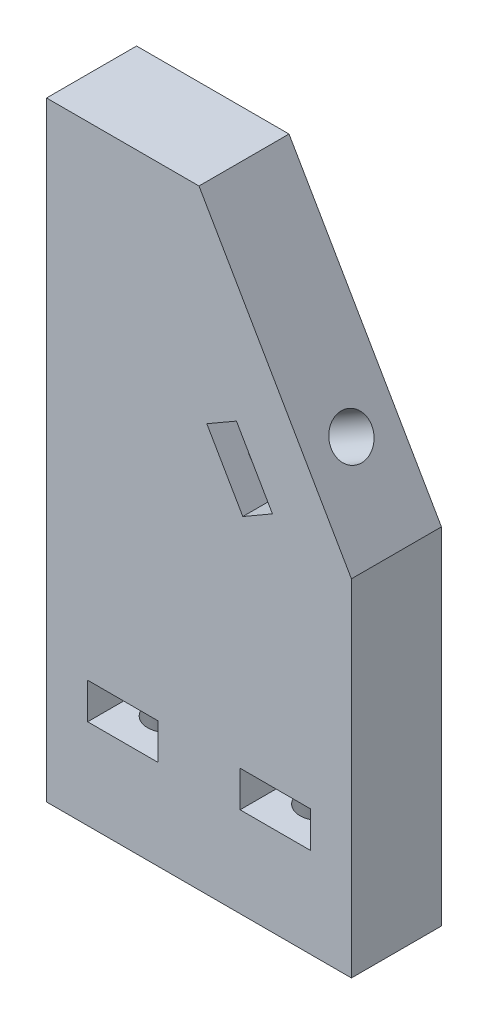
ISO-10303-21;
HEADER;
FILE_DESCRIPTION(('STEP AP214'),'2;1');
FILE_NAME('part.step','',(''),(''),'','','');
FILE_SCHEMA(('AUTOMOTIVE_DESIGN { 1 0 10303 214 1 1 1 1 }'));
ENDSEC;
DATA;
#1=APPLICATION_CONTEXT('core data for automotive mechanical design processes');
#2=APPLICATION_PROTOCOL_DEFINITION('international standard','automotive_design',2000,#1);
#3=PRODUCT_CONTEXT('',#1,'mechanical');
#4=PRODUCT('Part','Part','',(#3));
#5=PRODUCT_RELATED_PRODUCT_CATEGORY('part','',(#4));
#6=PRODUCT_DEFINITION_FORMATION('','',#4);
#7=PRODUCT_DEFINITION_CONTEXT('part definition',#1,'design');
#8=PRODUCT_DEFINITION('design','',#6,#7);
#9=PRODUCT_DEFINITION_SHAPE('','',#8);
#10=(LENGTH_UNIT() NAMED_UNIT(*) SI_UNIT(.MILLI.,.METRE.));
#11=(NAMED_UNIT(*) PLANE_ANGLE_UNIT() SI_UNIT($,.RADIAN.));
#12=(NAMED_UNIT(*) SI_UNIT($,.STERADIAN.) SOLID_ANGLE_UNIT());
#13=UNCERTAINTY_MEASURE_WITH_UNIT(LENGTH_MEASURE(1.E-05),#10,'distance_accuracy_value','');
#14=(GEOMETRIC_REPRESENTATION_CONTEXT(3) GLOBAL_UNCERTAINTY_ASSIGNED_CONTEXT((#13)) GLOBAL_UNIT_ASSIGNED_CONTEXT((#10,
#11,#12)) REPRESENTATION_CONTEXT('',''));
#15=CARTESIAN_POINT('',(0.,0.,0.));
#16=DIRECTION('',(0.,0.,1.));
#17=DIRECTION('',(1.,0.,0.));
#18=AXIS2_PLACEMENT_3D('',#15,#16,#17);
#19=CARTESIAN_POINT('',(0.,0.,7.5));
#20=DIRECTION('',(0.,0.,1.));
#21=DIRECTION('',(1.,0.,0.));
#22=AXIS2_PLACEMENT_3D('',#19,#20,#21);
#23=PLANE('',#22);
#24=DIRECTION('',(-1.,0.,0.));
#25=VECTOR('',#24,1.);
#26=CARTESIAN_POINT('',(-43.95,-7.80295474387528,7.5));
#27=LINE('',#26,#25);
#28=CARTESIAN_POINT('',(-32.25,-7.80295474387528,7.5));
#29=VERTEX_POINT('',#28);
#30=CARTESIAN_POINT('',(-43.95,-7.80295474387528,7.5));
#31=VERTEX_POINT('',#30);
#32=EDGE_CURVE('E172',#29,#31,#27,.T.);
#33=ORIENTED_EDGE('',*,*,#32,.F.);
#34=DIRECTION('',(0.,-1.,0.));
#35=VECTOR('',#34,1.);
#36=CARTESIAN_POINT('',(-32.25,-7.80295474387528,7.5));
#37=LINE('',#36,#35);
#38=CARTESIAN_POINT('',(-32.25,-13.8029547438753,7.5));
#39=VERTEX_POINT('',#38);
#40=EDGE_CURVE('E211',#29,#39,#37,.T.);
#41=ORIENTED_EDGE('',*,*,#40,.T.);
#42=DIRECTION('',(-1.,0.,0.));
#43=VECTOR('',#42,1.);
#44=CARTESIAN_POINT('',(-43.95,-13.8029547438753,7.5));
#45=LINE('',#44,#43);
#46=CARTESIAN_POINT('',(-43.95,-13.8029547438753,7.5));
#47=VERTEX_POINT('',#46);
#48=EDGE_CURVE('E174',#39,#47,#45,.T.);
#49=ORIENTED_EDGE('',*,*,#48,.T.);
#50=DIRECTION('',(0.,-1.,0.));
#51=VECTOR('',#50,1.);
#52=CARTESIAN_POINT('',(-43.95,-7.80295474387528,7.5));
#53=LINE('',#52,#51);
#54=EDGE_CURVE('E59',#31,#47,#53,.T.);
#55=ORIENTED_EDGE('',*,*,#54,.F.);
#56=EDGE_LOOP('',(#33,#41,#49,#55));
#57=FACE_BOUND('',#56,.T.);
#58=DIRECTION('',(-1.,0.,0.));
#59=VECTOR('',#58,1.);
#60=CARTESIAN_POINT('',(-25.4000000000001,72.7970452561247,7.5));
#61=LINE('',#60,#59);
#62=CARTESIAN_POINT('',(-25.4000000000001,72.7970452561247,7.5));
#63=VERTEX_POINT('',#62);
#64=CARTESIAN_POINT('',(-50.8,72.7970452561247,7.5));
#65=VERTEX_POINT('',#64);
#66=EDGE_CURVE('E310',#63,#65,#61,.T.);
#67=ORIENTED_EDGE('',*,*,#66,.T.);
#68=DIRECTION('',(0.,-1.,0.));
#69=VECTOR('',#68,1.);
#70=CARTESIAN_POINT('',(-50.8,72.7970452561247,7.5));
#71=LINE('',#70,#69);
#72=CARTESIAN_POINT('',(-50.8,-28.8029547438753,7.5));
#73=VERTEX_POINT('',#72);
#74=EDGE_CURVE('E314',#65,#73,#71,.T.);
#75=ORIENTED_EDGE('',*,*,#74,.T.);
#76=DIRECTION('',(1.,0.,0.));
#77=VECTOR('',#76,1.);
#78=CARTESIAN_POINT('',(-50.8,-28.8029547438753,7.5));
#79=LINE('',#78,#77);
#80=CARTESIAN_POINT('',(0.,-28.8029547438753,7.5));
#81=VERTEX_POINT('',#80);
#82=EDGE_CURVE('E318',#73,#81,#79,.T.);
#83=ORIENTED_EDGE('',*,*,#82,.T.);
#84=DIRECTION('',(0.,1.,0.));
#85=VECTOR('',#84,1.);
#86=CARTESIAN_POINT('',(0.,-28.8029547438753,7.5));
#87=LINE('',#86,#85);
#88=CARTESIAN_POINT('',(0.,28.8029547438753,7.5));
#89=VERTEX_POINT('',#88);
#90=EDGE_CURVE('E321',#81,#89,#87,.T.);
#91=ORIENTED_EDGE('',*,*,#90,.T.);
#92=DIRECTION('',(-0.500000000000002,0.866025403784438,0.));
#93=VECTOR('',#92,1.);
#94=CARTESIAN_POINT('',(0.,28.8029547438753,7.5));
#95=LINE('',#94,#93);
#96=EDGE_CURVE('E324',#89,#63,#95,.T.);
#97=ORIENTED_EDGE('',*,*,#96,.T.);
#98=EDGE_LOOP('',(#67,#75,#83,#91,#97));
#99=FACE_BOUND('',#98,.T.);
#100=DIRECTION('',(0.866025403784438,0.500000000000001,0.));
#101=VECTOR('',#100,1.);
#102=CARTESIAN_POINT('',(-18.0965988394157,28.7471833779352,7.5));
#103=LINE('',#102,#101);
#104=CARTESIAN_POINT('',(-18.0965988394157,28.7471833779352,7.5));
#105=VERTEX_POINT('',#104);
#106=CARTESIAN_POINT('',(-13.1602540378444,31.5971833779352,7.5));
#107=VERTEX_POINT('',#106);
#108=EDGE_CURVE('E304',#105,#107,#103,.T.);
#109=ORIENTED_EDGE('',*,*,#108,.F.);
#110=DIRECTION('',(0.500000000000001,-0.866025403784438,0.));
#111=VECTOR('',#110,1.);
#112=CARTESIAN_POINT('',(-24.0965988394157,39.1394882233485,7.5));
#113=LINE('',#112,#111);
#114=CARTESIAN_POINT('',(-24.0965988394157,39.1394882233485,7.5));
#115=VERTEX_POINT('',#114);
#116=EDGE_CURVE('E270',#115,#105,#113,.T.);
#117=ORIENTED_EDGE('',*,*,#116,.F.);
#118=DIRECTION('',(0.866025403784438,0.500000000000001,0.));
#119=VECTOR('',#118,1.);
#120=CARTESIAN_POINT('',(-24.0965988394157,39.1394882233485,7.5));
#121=LINE('',#120,#119);
#122=CARTESIAN_POINT('',(-19.1602540378444,41.9894882233485,7.5));
#123=VERTEX_POINT('',#122);
#124=EDGE_CURVE('E282',#115,#123,#121,.T.);
#125=ORIENTED_EDGE('',*,*,#124,.T.);
#126=DIRECTION('',(0.500000000000001,-0.866025403784438,0.));
#127=VECTOR('',#126,1.);
#128=CARTESIAN_POINT('',(-19.1602540378444,41.9894882233485,7.5));
#129=LINE('',#128,#127);
#130=EDGE_CURVE('E286',#123,#107,#129,.T.);
#131=ORIENTED_EDGE('',*,*,#130,.T.);
#132=EDGE_LOOP('',(#109,#117,#125,#131));
#133=FACE_BOUND('',#132,.T.);
#134=DIRECTION('',(0.,-1.,0.));
#135=VECTOR('',#134,1.);
#136=CARTESIAN_POINT('',(-18.55,-7.80295474387528,7.5));
#137=LINE('',#136,#135);
#138=CARTESIAN_POINT('',(-18.55,-7.80295474387528,7.5));
#139=VERTEX_POINT('',#138);
#140=CARTESIAN_POINT('',(-18.55,-13.8029547438753,7.5));
#141=VERTEX_POINT('',#140);
#142=EDGE_CURVE('E67',#139,#141,#137,.T.);
#143=ORIENTED_EDGE('',*,*,#142,.F.);
#144=DIRECTION('',(-1.,0.,0.));
#145=VECTOR('',#144,1.);
#146=CARTESIAN_POINT('',(-6.85,-7.80295474387528,7.5));
#147=LINE('',#146,#145);
#148=CARTESIAN_POINT('',(-6.85,-7.80295474387528,7.5));
#149=VERTEX_POINT('',#148);
#150=EDGE_CURVE('E225',#149,#139,#147,.T.);
#151=ORIENTED_EDGE('',*,*,#150,.F.);
#152=DIRECTION('',(0.,-1.,0.));
#153=VECTOR('',#152,1.);
#154=CARTESIAN_POINT('',(-6.85,-7.80295474387528,7.5));
#155=LINE('',#154,#153);
#156=CARTESIAN_POINT('',(-6.85,-13.8029547438753,7.5));
#157=VERTEX_POINT('',#156);
#158=EDGE_CURVE('E253',#149,#157,#155,.T.);
#159=ORIENTED_EDGE('',*,*,#158,.T.);
#160=DIRECTION('',(-1.,0.,0.));
#161=VECTOR('',#160,1.);
#162=CARTESIAN_POINT('',(-6.85,-13.8029547438753,7.5));
#163=LINE('',#162,#161);
#164=EDGE_CURVE('E242',#157,#141,#163,.T.);
#165=ORIENTED_EDGE('',*,*,#164,.T.);
#166=EDGE_LOOP('',(#143,#151,#159,#165));
#167=FACE_BOUND('',#166,.T.);
#168=ADVANCED_FACE('F43',(#57,#99,#133,#167),#23,.T.);
#169=CARTESIAN_POINT('',(0.,0.,-7.5));
#170=DIRECTION('',(0.,0.,1.));
#171=DIRECTION('',(1.,0.,0.));
#172=AXIS2_PLACEMENT_3D('',#169,#170,#171);
#173=PLANE('',#172);
#174=DIRECTION('',(0.,-1.,0.));
#175=VECTOR('',#174,1.);
#176=CARTESIAN_POINT('',(-32.25,-7.80295474387528,-7.5));
#177=LINE('',#176,#175);
#178=CARTESIAN_POINT('',(-32.25,-7.80295474387528,-7.5));
#179=VERTEX_POINT('',#178);
#180=CARTESIAN_POINT('',(-32.25,-13.8029547438753,-7.5));
#181=VERTEX_POINT('',#180);
#182=EDGE_CURVE('E183',#179,#181,#177,.T.);
#183=ORIENTED_EDGE('',*,*,#182,.F.);
#184=DIRECTION('',(1.,0.,0.));
#185=VECTOR('',#184,1.);
#186=CARTESIAN_POINT('',(-32.25,-7.80295474387528,-7.5));
#187=LINE('',#186,#185);
#188=CARTESIAN_POINT('',(-43.95,-7.80295474387528,-7.5));
#189=VERTEX_POINT('',#188);
#190=EDGE_CURVE('E169',#189,#179,#187,.T.);
#191=ORIENTED_EDGE('',*,*,#190,.F.);
#192=DIRECTION('',(0.,-1.,0.));
#193=VECTOR('',#192,1.);
#194=CARTESIAN_POINT('',(-43.95,-7.80295474387528,-7.5));
#195=LINE('',#194,#193);
#196=CARTESIAN_POINT('',(-43.95,-13.8029547438753,-7.5));
#197=VERTEX_POINT('',#196);
#198=EDGE_CURVE('E177',#189,#197,#195,.T.);
#199=ORIENTED_EDGE('',*,*,#198,.T.);
#200=DIRECTION('',(1.,0.,0.));
#201=VECTOR('',#200,1.);
#202=CARTESIAN_POINT('',(-32.25,-13.8029547438753,-7.5));
#203=LINE('',#202,#201);
#204=EDGE_CURVE('E198',#197,#181,#203,.T.);
#205=ORIENTED_EDGE('',*,*,#204,.T.);
#206=EDGE_LOOP('',(#183,#191,#199,#205));
#207=FACE_BOUND('',#206,.T.);
#208=DIRECTION('',(-0.500000000000001,0.866025403784438,0.));
#209=VECTOR('',#208,1.);
#210=CARTESIAN_POINT('',(-18.0965988394157,28.7471833779352,-7.5));
#211=LINE('',#210,#209);
#212=CARTESIAN_POINT('',(-18.0965988394157,28.7471833779352,-7.5));
#213=VERTEX_POINT('',#212);
#214=CARTESIAN_POINT('',(-24.0965988394157,39.1394882233485,-7.5));
#215=VERTEX_POINT('',#214);
#216=EDGE_CURVE('E278',#213,#215,#211,.T.);
#217=ORIENTED_EDGE('',*,*,#216,.F.);
#218=DIRECTION('',(0.866025403784438,0.500000000000001,0.));
#219=VECTOR('',#218,1.);
#220=CARTESIAN_POINT('',(-18.0965988394157,28.7471833779352,-7.5));
#221=LINE('',#220,#219);
#222=CARTESIAN_POINT('',(-13.1602540378444,31.5971833779352,-7.5));
#223=VERTEX_POINT('',#222);
#224=EDGE_CURVE('E300',#213,#223,#221,.T.);
#225=ORIENTED_EDGE('',*,*,#224,.T.);
#226=DIRECTION('',(-0.500000000000001,0.866025403784438,0.));
#227=VECTOR('',#226,1.);
#228=CARTESIAN_POINT('',(-13.1602540378444,31.5971833779352,-7.5));
#229=LINE('',#228,#227);
#230=CARTESIAN_POINT('',(-19.1602540378444,41.9894882233485,-7.5));
#231=VERTEX_POINT('',#230);
#232=EDGE_CURVE('E271',#223,#231,#229,.T.);
#233=ORIENTED_EDGE('',*,*,#232,.T.);
#234=DIRECTION('',(0.866025403784438,0.500000000000001,0.));
#235=VECTOR('',#234,1.);
#236=CARTESIAN_POINT('',(-24.0965988394157,39.1394882233485,-7.5));
#237=LINE('',#236,#235);
#238=EDGE_CURVE('E296',#215,#231,#237,.T.);
#239=ORIENTED_EDGE('',*,*,#238,.F.);
#240=EDGE_LOOP('',(#217,#225,#233,#239));
#241=FACE_BOUND('',#240,.T.);
#242=DIRECTION('',(-1.,0.,0.));
#243=VECTOR('',#242,1.);
#244=CARTESIAN_POINT('',(-25.4000000000001,72.7970452561247,-7.5));
#245=LINE('',#244,#243);
#246=CARTESIAN_POINT('',(-25.4000000000001,72.7970452561247,-7.5));
#247=VERTEX_POINT('',#246);
#248=CARTESIAN_POINT('',(-50.8,72.7970452561247,-7.5));
#249=VERTEX_POINT('',#248);
#250=EDGE_CURVE('E299',#247,#249,#245,.T.);
#251=ORIENTED_EDGE('',*,*,#250,.F.);
#252=DIRECTION('',(-0.500000000000002,0.866025403784438,0.));
#253=VECTOR('',#252,1.);
#254=CARTESIAN_POINT('',(0.,28.8029547438753,-7.5));
#255=LINE('',#254,#253);
#256=CARTESIAN_POINT('',(0.,28.8029547438753,-7.5));
#257=VERTEX_POINT('',#256);
#258=EDGE_CURVE('E315',#257,#247,#255,.T.);
#259=ORIENTED_EDGE('',*,*,#258,.F.);
#260=DIRECTION('',(0.,1.,0.));
#261=VECTOR('',#260,1.);
#262=CARTESIAN_POINT('',(0.,-28.8029547438753,-7.5));
#263=LINE('',#262,#261);
#264=CARTESIAN_POINT('',(0.,-28.8029547438753,-7.5));
#265=VERTEX_POINT('',#264);
#266=EDGE_CURVE('E338',#265,#257,#263,.T.);
#267=ORIENTED_EDGE('',*,*,#266,.F.);
#268=DIRECTION('',(1.,0.,0.));
#269=VECTOR('',#268,1.);
#270=CARTESIAN_POINT('',(-25.4000000000001,-28.8029547438753,-7.5));
#271=LINE('',#270,#269);
#272=CARTESIAN_POINT('',(-50.8,-28.8029547438753,-7.5));
#273=VERTEX_POINT('',#272);
#274=EDGE_CURVE('E335',#273,#265,#271,.T.);
#275=ORIENTED_EDGE('',*,*,#274,.F.);
#276=DIRECTION('',(0.,-1.,0.));
#277=VECTOR('',#276,1.);
#278=CARTESIAN_POINT('',(-50.8,72.7970452561247,-7.5));
#279=LINE('',#278,#277);
#280=EDGE_CURVE('E331',#249,#273,#279,.T.);
#281=ORIENTED_EDGE('',*,*,#280,.F.);
#282=EDGE_LOOP('',(#251,#259,#267,#275,#281));
#283=FACE_BOUND('',#282,.T.);
#284=DIRECTION('',(1.,0.,0.));
#285=VECTOR('',#284,1.);
#286=CARTESIAN_POINT('',(-18.55,-7.80295474387528,-7.5));
#287=LINE('',#286,#285);
#288=CARTESIAN_POINT('',(-18.55,-7.80295474387528,-7.5));
#289=VERTEX_POINT('',#288);
#290=CARTESIAN_POINT('',(-6.84999999999999,-7.80295474387528,-7.5));
#291=VERTEX_POINT('',#290);
#292=EDGE_CURVE('E217',#289,#291,#287,.T.);
#293=ORIENTED_EDGE('',*,*,#292,.F.);
#294=DIRECTION('',(0.,-1.,0.));
#295=VECTOR('',#294,1.);
#296=CARTESIAN_POINT('',(-18.55,-7.80295474387528,-7.5));
#297=LINE('',#296,#295);
#298=CARTESIAN_POINT('',(-18.55,-13.8029547438753,-7.5));
#299=VERTEX_POINT('',#298);
#300=EDGE_CURVE('E199',#289,#299,#297,.T.);
#301=ORIENTED_EDGE('',*,*,#300,.T.);
#302=DIRECTION('',(1.,0.,0.));
#303=VECTOR('',#302,1.);
#304=CARTESIAN_POINT('',(-18.55,-13.8029547438753,-7.5));
#305=LINE('',#304,#303);
#306=CARTESIAN_POINT('',(-6.84999999999999,-13.8029547438753,-7.5));
#307=VERTEX_POINT('',#306);
#308=EDGE_CURVE('E233',#299,#307,#305,.T.);
#309=ORIENTED_EDGE('',*,*,#308,.T.);
#310=DIRECTION('',(0.,-1.,0.));
#311=VECTOR('',#310,1.);
#312=CARTESIAN_POINT('',(-6.84999999999999,-7.80295474387528,-7.5));
#313=LINE('',#312,#311);
#314=EDGE_CURVE('E232',#291,#307,#313,.T.);
#315=ORIENTED_EDGE('',*,*,#314,.F.);
#316=EDGE_LOOP('',(#293,#301,#309,#315));
#317=FACE_BOUND('',#316,.T.);
#318=ADVANCED_FACE('F185',(#207,#241,#283,#317),#173,.F.);
#319=CARTESIAN_POINT('',(-25.4000000000001,72.7970452561247,7.5));
#320=DIRECTION('',(0.,-1.,0.));
#321=DIRECTION('',(1.,0.,0.));
#322=AXIS2_PLACEMENT_3D('',#319,#320,#321);
#323=PLANE('',#322);
#324=ORIENTED_EDGE('',*,*,#250,.T.);
#325=DIRECTION('',(0.,0.,-1.));
#326=VECTOR('',#325,1.);
#327=CARTESIAN_POINT('',(-50.8,72.7970452561247,7.5));
#328=LINE('',#327,#326);
#329=EDGE_CURVE('E13',#65,#249,#328,.T.);
#330=ORIENTED_EDGE('',*,*,#329,.F.);
#331=ORIENTED_EDGE('',*,*,#66,.F.);
#332=DIRECTION('',(0.,0.,-1.));
#333=VECTOR('',#332,1.);
#334=CARTESIAN_POINT('',(-25.4000000000001,72.7970452561247,7.5));
#335=LINE('',#334,#333);
#336=EDGE_CURVE('E327',#63,#247,#335,.T.);
#337=ORIENTED_EDGE('',*,*,#336,.T.);
#338=EDGE_LOOP('',(#324,#330,#331,#337));
#339=FACE_BOUND('',#338,.T.);
#340=ADVANCED_FACE('F45',(#339),#323,.F.);
#341=CARTESIAN_POINT('',(-50.8,72.7970452561247,7.5));
#342=DIRECTION('',(1.,0.,0.));
#343=DIRECTION('',(0.,1.,0.));
#344=AXIS2_PLACEMENT_3D('',#341,#342,#343);
#345=PLANE('',#344);
#346=ORIENTED_EDGE('',*,*,#280,.T.);
#347=DIRECTION('',(0.,0.,-1.));
#348=VECTOR('',#347,1.);
#349=CARTESIAN_POINT('',(-50.8,-28.8029547438753,7.5));
#350=LINE('',#349,#348);
#351=EDGE_CURVE('E52',#73,#273,#350,.T.);
#352=ORIENTED_EDGE('',*,*,#351,.F.);
#353=ORIENTED_EDGE('',*,*,#74,.F.);
#354=ORIENTED_EDGE('',*,*,#329,.T.);
#355=EDGE_LOOP('',(#346,#352,#353,#354));
#356=FACE_BOUND('',#355,.T.);
#357=ADVANCED_FACE('F361',(#356),#345,.F.);
#358=CARTESIAN_POINT('',(-25.4000000000001,-28.8029547438753,7.5));
#359=DIRECTION('',(0.,1.,0.));
#360=DIRECTION('',(0.,0.,1.));
#361=AXIS2_PLACEMENT_3D('',#358,#359,#360);
#362=PLANE('',#361);
#363=CARTESIAN_POINT('',(-38.1,-28.8029547438753,0.));
#364=DIRECTION('',(0.,1.,0.));
#365=DIRECTION('',(0.,0.,1.));
#366=AXIS2_PLACEMENT_3D('',#363,#364,#365);
#367=CIRCLE('',#366,3.37350099999999);
#368=CARTESIAN_POINT('',(-38.1,-28.8029547438753,3.37350099999999));
#369=VERTEX_POINT('',#368);
#370=EDGE_CURVE('E408',#369,#369,#367,.T.);
#371=ORIENTED_EDGE('',*,*,#370,.T.);
#372=EDGE_LOOP('',(#371));
#373=FACE_BOUND('',#372,.T.);
#374=CARTESIAN_POINT('',(-12.7,-28.8029547438753,0.));
#375=DIRECTION('',(0.,1.,0.));
#376=DIRECTION('',(0.,0.,1.));
#377=AXIS2_PLACEMENT_3D('',#374,#375,#376);
#378=CIRCLE('',#377,3.37350099999999);
#379=CARTESIAN_POINT('',(-12.7,-28.8029547438753,3.37350099999999));
#380=VERTEX_POINT('',#379);
#381=EDGE_CURVE('E238',#380,#380,#378,.T.);
#382=ORIENTED_EDGE('',*,*,#381,.T.);
#383=EDGE_LOOP('',(#382));
#384=FACE_BOUND('',#383,.T.);
#385=ORIENTED_EDGE('',*,*,#274,.T.);
#386=DIRECTION('',(0.,0.,-1.));
#387=VECTOR('',#386,1.);
#388=CARTESIAN_POINT('',(0.,-28.8029547438753,7.5));
#389=LINE('',#388,#387);
#390=EDGE_CURVE('E350',#81,#265,#389,.T.);
#391=ORIENTED_EDGE('',*,*,#390,.F.);
#392=ORIENTED_EDGE('',*,*,#82,.F.);
#393=ORIENTED_EDGE('',*,*,#351,.T.);
#394=EDGE_LOOP('',(#385,#391,#392,#393));
#395=FACE_BOUND('',#394,.T.);
#396=ADVANCED_FACE('F358',(#373,#384,#395),#362,.F.);
#397=CARTESIAN_POINT('',(0.,-28.8029547438753,7.5));
#398=DIRECTION('',(-1.,0.,0.));
#399=DIRECTION('',(0.,-1.,0.));
#400=AXIS2_PLACEMENT_3D('',#397,#398,#399);
#401=PLANE('',#400);
#402=ORIENTED_EDGE('',*,*,#266,.T.);
#403=DIRECTION('',(0.,0.,-1.));
#404=VECTOR('',#403,1.);
#405=CARTESIAN_POINT('',(0.,28.8029547438753,7.5));
#406=LINE('',#405,#404);
#407=EDGE_CURVE('E346',#89,#257,#406,.T.);
#408=ORIENTED_EDGE('',*,*,#407,.F.);
#409=ORIENTED_EDGE('',*,*,#90,.F.);
#410=ORIENTED_EDGE('',*,*,#390,.T.);
#411=EDGE_LOOP('',(#402,#408,#409,#410));
#412=FACE_BOUND('',#411,.T.);
#413=ADVANCED_FACE('F370',(#412),#401,.F.);
#414=CARTESIAN_POINT('',(0.,28.8029547438753,7.5));
#415=DIRECTION('',(-0.866025403784438,-0.500000000000001,0.));
#416=DIRECTION('',(0.500000000000002,-0.866025403784438,0.));
#417=AXIS2_PLACEMENT_3D('',#414,#415,#416);
#418=PLANE('',#417);
#419=CARTESIAN_POINT('',(-7.50000000000003,41.7933358006419,0.));
#420=DIRECTION('',(-0.866025403784438,-0.500000000000001,0.));
#421=DIRECTION('',(0.500000000000002,-0.866025403784438,0.));
#422=AXIS2_PLACEMENT_3D('',#419,#420,#421);
#423=CIRCLE('',#422,3.37350099999999);
#424=CARTESIAN_POINT('',(-5.81324950000003,38.8717982349497,0.));
#425=VERTEX_POINT('',#424);
#426=EDGE_CURVE('E262',#425,#425,#423,.T.);
#427=ORIENTED_EDGE('',*,*,#426,.T.);
#428=EDGE_LOOP('',(#427));
#429=FACE_BOUND('',#428,.T.);
#430=ORIENTED_EDGE('',*,*,#258,.T.);
#431=ORIENTED_EDGE('',*,*,#336,.F.);
#432=ORIENTED_EDGE('',*,*,#96,.F.);
#433=ORIENTED_EDGE('',*,*,#407,.T.);
#434=EDGE_LOOP('',(#430,#431,#432,#433));
#435=FACE_BOUND('',#434,.T.);
#436=ADVANCED_FACE('F374',(#429,#435),#418,.F.);
#437=CARTESIAN_POINT('',(-18.0965988394157,28.7471833779352,-3.46410161513775));
#438=DIRECTION('',(0.500000000000001,-0.866025403784438,0.));
#439=DIRECTION('',(0.866025403784438,0.500000000000001,0.));
#440=AXIS2_PLACEMENT_3D('',#437,#438,#439);
#441=PLANE('',#440);
#442=DIRECTION('',(0.,0.,-1.));
#443=VECTOR('',#442,1.);
#444=CARTESIAN_POINT('',(-13.1602540378444,31.5971833779352,-3.46410161513775));
#445=LINE('',#444,#443);
#446=EDGE_CURVE('E290',#107,#223,#445,.T.);
#447=ORIENTED_EDGE('',*,*,#446,.T.);
#448=ORIENTED_EDGE('',*,*,#224,.F.);
#449=DIRECTION('',(0.,0.,-1.));
#450=VECTOR('',#449,1.);
#451=CARTESIAN_POINT('',(-18.0965988394157,28.7471833779352,7.5));
#452=LINE('',#451,#450);
#453=EDGE_CURVE('E275',#105,#213,#452,.T.);
#454=ORIENTED_EDGE('',*,*,#453,.F.);
#455=ORIENTED_EDGE('',*,*,#108,.T.);
#456=EDGE_LOOP('',(#447,#448,#454,#455));
#457=FACE_BOUND('',#456,.T.);
#458=ADVANCED_FACE('F397',(#457),#441,.F.);
#459=CARTESIAN_POINT('',(-24.0965988394157,39.1394882233485,3.46410161513774));
#460=DIRECTION('',(-0.500000000000001,0.866025403784438,0.));
#461=DIRECTION('',(-0.866025403784438,-0.500000000000001,0.));
#462=AXIS2_PLACEMENT_3D('',#459,#460,#461);
#463=PLANE('',#462);
#464=DIRECTION('',(0.,0.,1.));
#465=VECTOR('',#464,1.);
#466=CARTESIAN_POINT('',(-19.1602540378444,41.9894882233485,3.46410161513774));
#467=LINE('',#466,#465);
#468=EDGE_CURVE('E266',#231,#123,#467,.T.);
#469=ORIENTED_EDGE('',*,*,#468,.T.);
#470=ORIENTED_EDGE('',*,*,#124,.F.);
#471=DIRECTION('',(0.,0.,1.));
#472=VECTOR('',#471,1.);
#473=CARTESIAN_POINT('',(-24.0965988394157,39.1394882233485,-7.5));
#474=LINE('',#473,#472);
#475=EDGE_CURVE('E267',#215,#115,#474,.T.);
#476=ORIENTED_EDGE('',*,*,#475,.F.);
#477=ORIENTED_EDGE('',*,*,#238,.T.);
#478=EDGE_LOOP('',(#469,#470,#476,#477));
#479=FACE_BOUND('',#478,.T.);
#480=ADVANCED_FACE('F392',(#479),#463,.F.);
#481=CARTESIAN_POINT('',(-1.12455358329088,-0.649261314031151,0.));
#482=DIRECTION('',(0.866025403784438,0.500000000000001,0.));
#483=DIRECTION('',(-0.500000000000001,0.866025403784438,0.));
#484=AXIS2_PLACEMENT_3D('',#481,#482,#483);
#485=PLANE('',#484);
#486=CARTESIAN_POINT('',(-21.0965988394157,33.9433358006419,0.));
#487=DIRECTION('',(0.866025403784438,0.500000000000001,0.));
#488=DIRECTION('',(-0.500000000000001,0.866025403784438,0.));
#489=AXIS2_PLACEMENT_3D('',#486,#487,#488);
#490=CIRCLE('',#489,3.373501);
#491=CARTESIAN_POINT('',(-22.7833493394157,36.8648733663341,0.));
#492=VERTEX_POINT('',#491);
#493=EDGE_CURVE('E437',#492,#492,#490,.T.);
#494=ORIENTED_EDGE('',*,*,#493,.F.);
#495=EDGE_LOOP('',(#494));
#496=FACE_BOUND('',#495,.T.);
#497=ORIENTED_EDGE('',*,*,#475,.T.);
#498=ORIENTED_EDGE('',*,*,#116,.T.);
#499=ORIENTED_EDGE('',*,*,#453,.T.);
#500=ORIENTED_EDGE('',*,*,#216,.T.);
#501=EDGE_LOOP('',(#497,#498,#499,#500));
#502=FACE_BOUND('',#501,.T.);
#503=ADVANCED_FACE('F516',(#496,#502),#485,.T.);
#504=CARTESIAN_POINT('',(3.81179121828041,2.20073868596886,0.));
#505=DIRECTION('',(0.866025403784438,0.500000000000001,0.));
#506=DIRECTION('',(-0.500000000000001,0.866025403784438,0.));
#507=AXIS2_PLACEMENT_3D('',#504,#505,#506);
#508=PLANE('',#507);
#509=CARTESIAN_POINT('',(-16.1602540378444,36.7933358006419,0.));
#510=DIRECTION('',(-0.866025403784438,-0.500000000000001,0.));
#511=DIRECTION('',(0.500000000000001,-0.866025403784438,0.));
#512=AXIS2_PLACEMENT_3D('',#509,#510,#511);
#513=CIRCLE('',#512,3.373501);
#514=CARTESIAN_POINT('',(-14.4735035378444,33.8717982349497,0.));
#515=VERTEX_POINT('',#514);
#516=EDGE_CURVE('E210',#515,#515,#513,.T.);
#517=ORIENTED_EDGE('',*,*,#516,.F.);
#518=EDGE_LOOP('',(#517));
#519=FACE_BOUND('',#518,.T.);
#520=ORIENTED_EDGE('',*,*,#232,.F.);
#521=ORIENTED_EDGE('',*,*,#446,.F.);
#522=ORIENTED_EDGE('',*,*,#130,.F.);
#523=ORIENTED_EDGE('',*,*,#468,.F.);
#524=EDGE_LOOP('',(#520,#521,#522,#523));
#525=FACE_BOUND('',#524,.T.);
#526=ADVANCED_FACE('F514',(#519,#525),#508,.F.);
#527=CARTESIAN_POINT('',(-16.1602540378444,36.7933358006419,0.));
#528=DIRECTION('',(-0.866025403784438,-0.500000000000001,0.));
#529=DIRECTION('',(0.500000000000001,-0.866025403784438,0.));
#530=AXIS2_PLACEMENT_3D('',#527,#528,#529);
#531=CYLINDRICAL_SURFACE('',#530,3.37350099999999);
#532=ORIENTED_EDGE('',*,*,#516,.T.);
#533=EDGE_LOOP('',(#532));
#534=FACE_BOUND('',#533,.T.);
#535=ORIENTED_EDGE('',*,*,#426,.F.);
#536=EDGE_LOOP('',(#535));
#537=FACE_BOUND('',#536,.T.);
#538=ADVANCED_FACE('F508',(#534,#537),#531,.F.);
#539=CARTESIAN_POINT('',(-18.55,-7.80295474387528,-3.37749907475931));
#540=DIRECTION('',(-1.,0.,0.));
#541=DIRECTION('',(0.,0.,1.));
#542=AXIS2_PLACEMENT_3D('',#539,#540,#541);
#543=PLANE('',#542);
#544=DIRECTION('',(0.,0.,-1.));
#545=VECTOR('',#544,1.);
#546=CARTESIAN_POINT('',(-18.55,-13.8029547438753,-3.37749907475931));
#547=LINE('',#546,#545);
#548=EDGE_CURVE('E222',#141,#299,#547,.T.);
#549=ORIENTED_EDGE('',*,*,#548,.T.);
#550=ORIENTED_EDGE('',*,*,#300,.F.);
#551=DIRECTION('',(0.,0.,-1.));
#552=VECTOR('',#551,1.);
#553=CARTESIAN_POINT('',(-18.55,-7.80295474387528,7.5));
#554=LINE('',#553,#552);
#555=EDGE_CURVE('E229',#139,#289,#554,.T.);
#556=ORIENTED_EDGE('',*,*,#555,.F.);
#557=ORIENTED_EDGE('',*,*,#142,.T.);
#558=EDGE_LOOP('',(#549,#550,#556,#557));
#559=FACE_BOUND('',#558,.T.);
#560=ADVANCED_FACE('F505',(#559),#543,.F.);
#561=CARTESIAN_POINT('',(-6.85,-7.80295474387528,3.37749907475931));
#562=DIRECTION('',(1.,0.,0.));
#563=DIRECTION('',(0.,0.,-1.));
#564=AXIS2_PLACEMENT_3D('',#561,#562,#563);
#565=PLANE('',#564);
#566=DIRECTION('',(0.,0.,1.));
#567=VECTOR('',#566,1.);
#568=CARTESIAN_POINT('',(-6.85,-13.8029547438753,3.37749907475931));
#569=LINE('',#568,#567);
#570=EDGE_CURVE('E237',#307,#157,#569,.T.);
#571=ORIENTED_EDGE('',*,*,#570,.T.);
#572=ORIENTED_EDGE('',*,*,#158,.F.);
#573=DIRECTION('',(0.,0.,1.));
#574=VECTOR('',#573,1.);
#575=CARTESIAN_POINT('',(-6.84999999999999,-7.80295474387528,-7.5));
#576=LINE('',#575,#574);
#577=EDGE_CURVE('E221',#291,#149,#576,.T.);
#578=ORIENTED_EDGE('',*,*,#577,.F.);
#579=ORIENTED_EDGE('',*,*,#314,.T.);
#580=EDGE_LOOP('',(#571,#572,#578,#579));
#581=FACE_BOUND('',#580,.T.);
#582=ADVANCED_FACE('F500',(#581),#565,.F.);
#583=CARTESIAN_POINT('',(0.,-7.80295474387528,0.));
#584=DIRECTION('',(0.,-1.,0.));
#585=DIRECTION('',(0.,0.,-1.));
#586=AXIS2_PLACEMENT_3D('',#583,#584,#585);
#587=PLANE('',#586);
#588=CARTESIAN_POINT('',(-12.7,-7.80295474387528,0.));
#589=DIRECTION('',(0.,-1.,0.));
#590=DIRECTION('',(0.,0.,-1.));
#591=AXIS2_PLACEMENT_3D('',#588,#589,#590);
#592=CIRCLE('',#591,3.37350099999999);
#593=CARTESIAN_POINT('',(-12.7,-7.80295474387528,-3.373501));
#594=VERTEX_POINT('',#593);
#595=EDGE_CURVE('E424',#594,#594,#592,.T.);
#596=ORIENTED_EDGE('',*,*,#595,.F.);
#597=EDGE_LOOP('',(#596));
#598=FACE_BOUND('',#597,.T.);
#599=ORIENTED_EDGE('',*,*,#292,.T.);
#600=ORIENTED_EDGE('',*,*,#577,.T.);
#601=ORIENTED_EDGE('',*,*,#150,.T.);
#602=ORIENTED_EDGE('',*,*,#555,.T.);
#603=EDGE_LOOP('',(#599,#600,#601,#602));
#604=FACE_BOUND('',#603,.T.);
#605=ADVANCED_FACE('F497',(#598,#604),#587,.T.);
#606=CARTESIAN_POINT('',(0.,-13.8029547438753,0.));
#607=DIRECTION('',(0.,-1.,0.));
#608=DIRECTION('',(0.,0.,-1.));
#609=AXIS2_PLACEMENT_3D('',#606,#607,#608);
#610=PLANE('',#609);
#611=CARTESIAN_POINT('',(-12.7,-13.8029547438753,0.));
#612=DIRECTION('',(0.,1.,0.));
#613=DIRECTION('',(0.,0.,1.));
#614=AXIS2_PLACEMENT_3D('',#611,#612,#613);
#615=CIRCLE('',#614,3.37350099999999);
#616=CARTESIAN_POINT('',(-12.7,-13.8029547438753,3.37350099999998));
#617=VERTEX_POINT('',#616);
#618=EDGE_CURVE('E413',#617,#617,#615,.T.);
#619=ORIENTED_EDGE('',*,*,#618,.F.);
#620=EDGE_LOOP('',(#619));
#621=FACE_BOUND('',#620,.T.);
#622=ORIENTED_EDGE('',*,*,#308,.F.);
#623=ORIENTED_EDGE('',*,*,#548,.F.);
#624=ORIENTED_EDGE('',*,*,#164,.F.);
#625=ORIENTED_EDGE('',*,*,#570,.F.);
#626=EDGE_LOOP('',(#622,#623,#624,#625));
#627=FACE_BOUND('',#626,.T.);
#628=ADVANCED_FACE('F493',(#621,#627),#610,.F.);
#629=CARTESIAN_POINT('',(-32.25,-7.80295474387528,7.5));
#630=DIRECTION('',(1.,0.,0.));
#631=DIRECTION('',(0.,0.,-1.));
#632=AXIS2_PLACEMENT_3D('',#629,#630,#631);
#633=PLANE('',#632);
#634=DIRECTION('',(0.,0.,1.));
#635=VECTOR('',#634,1.);
#636=CARTESIAN_POINT('',(-32.25,-13.8029547438753,7.5));
#637=LINE('',#636,#635);
#638=EDGE_CURVE('E202',#181,#39,#637,.T.);
#639=ORIENTED_EDGE('',*,*,#638,.T.);
#640=ORIENTED_EDGE('',*,*,#40,.F.);
#641=DIRECTION('',(0.,0.,1.));
#642=VECTOR('',#641,1.);
#643=CARTESIAN_POINT('',(-32.25,-7.80295474387528,-3.37749907475931));
#644=LINE('',#643,#642);
#645=EDGE_CURVE('E188',#179,#29,#644,.T.);
#646=ORIENTED_EDGE('',*,*,#645,.F.);
#647=ORIENTED_EDGE('',*,*,#182,.T.);
#648=EDGE_LOOP('',(#639,#640,#646,#647));
#649=FACE_BOUND('',#648,.T.);
#650=ADVANCED_FACE('F490',(#649),#633,.F.);
#651=CARTESIAN_POINT('',(-43.95,-7.80295474387528,-7.5));
#652=DIRECTION('',(-1.,0.,0.));
#653=DIRECTION('',(0.,0.,1.));
#654=AXIS2_PLACEMENT_3D('',#651,#652,#653);
#655=PLANE('',#654);
#656=DIRECTION('',(0.,0.,-1.));
#657=VECTOR('',#656,1.);
#658=CARTESIAN_POINT('',(-43.95,-13.8029547438753,-7.5));
#659=LINE('',#658,#657);
#660=EDGE_CURVE('E179',#47,#197,#659,.T.);
#661=ORIENTED_EDGE('',*,*,#660,.T.);
#662=ORIENTED_EDGE('',*,*,#198,.F.);
#663=DIRECTION('',(0.,0.,-1.));
#664=VECTOR('',#663,1.);
#665=CARTESIAN_POINT('',(-43.95,-7.80295474387528,3.37749907475931));
#666=LINE('',#665,#664);
#667=EDGE_CURVE('E165',#31,#189,#666,.T.);
#668=ORIENTED_EDGE('',*,*,#667,.F.);
#669=ORIENTED_EDGE('',*,*,#54,.T.);
#670=EDGE_LOOP('',(#661,#662,#668,#669));
#671=FACE_BOUND('',#670,.T.);
#672=ADVANCED_FACE('F178',(#671),#655,.F.);
#673=CARTESIAN_POINT('',(0.,-7.80295474387528,0.));
#674=DIRECTION('',(0.,1.,0.));
#675=DIRECTION('',(0.,0.,1.));
#676=AXIS2_PLACEMENT_3D('',#673,#674,#675);
#677=PLANE('',#676);
#678=CARTESIAN_POINT('',(-38.1,-7.80295474387528,0.));
#679=DIRECTION('',(0.,1.,0.));
#680=DIRECTION('',(0.,0.,1.));
#681=AXIS2_PLACEMENT_3D('',#678,#679,#680);
#682=CIRCLE('',#681,3.373501);
#683=CARTESIAN_POINT('',(-38.1,-7.80295474387528,3.373501));
#684=VERTEX_POINT('',#683);
#685=EDGE_CURVE('E428',#684,#684,#682,.T.);
#686=ORIENTED_EDGE('',*,*,#685,.T.);
#687=EDGE_LOOP('',(#686));
#688=FACE_BOUND('',#687,.T.);
#689=ORIENTED_EDGE('',*,*,#667,.T.);
#690=ORIENTED_EDGE('',*,*,#190,.T.);
#691=ORIENTED_EDGE('',*,*,#645,.T.);
#692=ORIENTED_EDGE('',*,*,#32,.T.);
#693=EDGE_LOOP('',(#689,#690,#691,#692));
#694=FACE_BOUND('',#693,.T.);
#695=ADVANCED_FACE('F167',(#688,#694),#677,.F.);
#696=CARTESIAN_POINT('',(0.,-13.8029547438753,0.));
#697=DIRECTION('',(0.,1.,0.));
#698=DIRECTION('',(0.,0.,1.));
#699=AXIS2_PLACEMENT_3D('',#696,#697,#698);
#700=PLANE('',#699);
#701=CARTESIAN_POINT('',(-38.1,-13.8029547438753,0.));
#702=DIRECTION('',(0.,1.,0.));
#703=DIRECTION('',(0.,0.,1.));
#704=AXIS2_PLACEMENT_3D('',#701,#702,#703);
#705=CIRCLE('',#704,3.37350099999999);
#706=CARTESIAN_POINT('',(-38.1,-13.8029547438753,3.37350099999999));
#707=VERTEX_POINT('',#706);
#708=EDGE_CURVE('E420',#707,#707,#705,.T.);
#709=ORIENTED_EDGE('',*,*,#708,.F.);
#710=EDGE_LOOP('',(#709));
#711=FACE_BOUND('',#710,.T.);
#712=ORIENTED_EDGE('',*,*,#48,.F.);
#713=ORIENTED_EDGE('',*,*,#638,.F.);
#714=ORIENTED_EDGE('',*,*,#204,.F.);
#715=ORIENTED_EDGE('',*,*,#660,.F.);
#716=EDGE_LOOP('',(#712,#713,#714,#715));
#717=FACE_BOUND('',#716,.T.);
#718=ADVANCED_FACE('F483',(#711,#717),#700,.T.);
#719=CARTESIAN_POINT('',(-12.7,-13.8029547438753,0.));
#720=DIRECTION('',(0.,1.,0.));
#721=DIRECTION('',(0.,0.,1.));
#722=AXIS2_PLACEMENT_3D('',#719,#720,#721);
#723=CYLINDRICAL_SURFACE('',#722,3.37350099999999);
#724=ORIENTED_EDGE('',*,*,#381,.F.);
#725=EDGE_LOOP('',(#724));
#726=FACE_BOUND('',#725,.T.);
#727=ORIENTED_EDGE('',*,*,#618,.T.);
#728=EDGE_LOOP('',(#727));
#729=FACE_BOUND('',#728,.T.);
#730=ADVANCED_FACE('F479',(#726,#729),#723,.F.);
#731=CARTESIAN_POINT('',(-38.1,-13.8029547438753,0.));
#732=DIRECTION('',(0.,1.,0.));
#733=DIRECTION('',(0.,0.,1.));
#734=AXIS2_PLACEMENT_3D('',#731,#732,#733);
#735=CYLINDRICAL_SURFACE('',#734,3.37350099999999);
#736=ORIENTED_EDGE('',*,*,#370,.F.);
#737=EDGE_LOOP('',(#736));
#738=FACE_BOUND('',#737,.T.);
#739=ORIENTED_EDGE('',*,*,#708,.T.);
#740=EDGE_LOOP('',(#739));
#741=FACE_BOUND('',#740,.T.);
#742=ADVANCED_FACE('F465',(#738,#741),#735,.F.);
#743=CARTESIAN_POINT('',(-38.1,21.7387469898831,0.));
#744=DIRECTION('',(0.,-1.,0.));
#745=DIRECTION('',(0.,0.,-1.));
#746=AXIS2_PLACEMENT_3D('',#743,#744,#745);
#747=CYLINDRICAL_SURFACE('',#746,3.373501);
#748=CARTESIAN_POINT('',(-38.1,2.19704525612472,0.));
#749=DIRECTION('',(0.,1.,0.));
#750=DIRECTION('',(0.,0.,1.));
#751=AXIS2_PLACEMENT_3D('',#748,#749,#750);
#752=CIRCLE('',#751,3.373501);
#753=CARTESIAN_POINT('',(-38.1,2.19704525612472,3.373501));
#754=VERTEX_POINT('',#753);
#755=EDGE_CURVE('E432',#754,#754,#752,.F.);
#756=ORIENTED_EDGE('',*,*,#755,.F.);
#757=EDGE_LOOP('',(#756));
#758=FACE_BOUND('',#757,.T.);
#759=ORIENTED_EDGE('',*,*,#685,.F.);
#760=EDGE_LOOP('',(#759));
#761=FACE_BOUND('',#760,.T.);
#762=ADVANCED_FACE('F461',(#758,#761),#747,.F.);
#763=CARTESIAN_POINT('',(0.,2.19704525612472,0.));
#764=DIRECTION('',(0.,1.,0.));
#765=DIRECTION('',(0.,0.,1.));
#766=AXIS2_PLACEMENT_3D('',#763,#764,#765);
#767=PLANE('',#766);
#768=ORIENTED_EDGE('',*,*,#755,.T.);
#769=EDGE_LOOP('',(#768));
#770=FACE_BOUND('',#769,.T.);
#771=ADVANCED_FACE('F464',(#770),#767,.F.);
#772=CARTESIAN_POINT('',(0.,2.19704525612472,0.));
#773=DIRECTION('',(0.,1.,0.));
#774=DIRECTION('',(0.,0.,1.));
#775=AXIS2_PLACEMENT_3D('',#772,#773,#774);
#776=PLANE('',#775);
#777=CARTESIAN_POINT('',(-12.7,2.19704525612472,0.));
#778=DIRECTION('',(0.,1.,0.));
#779=DIRECTION('',(0.,0.,1.));
#780=AXIS2_PLACEMENT_3D('',#777,#778,#779);
#781=CIRCLE('',#780,3.37350099999999);
#782=CARTESIAN_POINT('',(-12.7,2.19704525612472,3.37350099999999));
#783=VERTEX_POINT('',#782);
#784=EDGE_CURVE('E433',#783,#783,#781,.F.);
#785=ORIENTED_EDGE('',*,*,#784,.T.);
#786=EDGE_LOOP('',(#785));
#787=FACE_BOUND('',#786,.T.);
#788=ADVANCED_FACE('F469',(#787),#776,.F.);
#789=CARTESIAN_POINT('',(-12.7,21.7387469898831,0.));
#790=DIRECTION('',(0.,-1.,0.));
#791=DIRECTION('',(0.,0.,-1.));
#792=AXIS2_PLACEMENT_3D('',#789,#790,#791);
#793=CYLINDRICAL_SURFACE('',#792,3.37350099999999);
#794=ORIENTED_EDGE('',*,*,#595,.T.);
#795=EDGE_LOOP('',(#794));
#796=FACE_BOUND('',#795,.T.);
#797=ORIENTED_EDGE('',*,*,#784,.F.);
#798=EDGE_LOOP('',(#797));
#799=FACE_BOUND('',#798,.T.);
#800=ADVANCED_FACE('F457',(#796,#799),#793,.F.);
#801=CARTESIAN_POINT('',(-46.6804630118733,19.1724849337626,0.));
#802=DIRECTION('',(0.866025403784438,0.500000000000002,0.));
#803=DIRECTION('',(-0.500000000000002,0.866025403784438,0.));
#804=AXIS2_PLACEMENT_3D('',#801,#802,#803);
#805=CYLINDRICAL_SURFACE('',#804,3.373501);
#806=ORIENTED_EDGE('',*,*,#493,.T.);
#807=EDGE_LOOP('',(#806));
#808=FACE_BOUND('',#807,.T.);
#809=CARTESIAN_POINT('',(-29.7568528772601,28.9433358006418,0.));
#810=DIRECTION('',(0.866025403784438,0.500000000000001,0.));
#811=DIRECTION('',(-0.500000000000001,0.866025403784438,0.));
#812=AXIS2_PLACEMENT_3D('',#809,#810,#811);
#813=CIRCLE('',#812,3.373501);
#814=CARTESIAN_POINT('',(-31.4436033772601,31.864873366334,0.));
#815=VERTEX_POINT('',#814);
#816=EDGE_CURVE('E444',#815,#815,#813,.F.);
#817=ORIENTED_EDGE('',*,*,#816,.T.);
#818=EDGE_LOOP('',(#817));
#819=FACE_BOUND('',#818,.T.);
#820=ADVANCED_FACE('F449',(#808,#819),#805,.F.);
#821=CARTESIAN_POINT('',(-9.78480762113526,-5.64926131403117,0.));
#822=DIRECTION('',(0.866025403784438,0.500000000000001,0.));
#823=DIRECTION('',(-0.500000000000001,0.866025403784438,0.));
#824=AXIS2_PLACEMENT_3D('',#821,#822,#823);
#825=PLANE('',#824);
#826=ORIENTED_EDGE('',*,*,#816,.F.);
#827=EDGE_LOOP('',(#826));
#828=FACE_BOUND('',#827,.T.);
#829=ADVANCED_FACE('F451',(#828),#825,.T.);
#830=CLOSED_SHELL('',(#168,#318,#340,#357,#396,#413,#436,#458,#480,#503,#526,#538,#560,#582,
#605,#628,#650,#672,#695,#718,#730,#742,#762,#771,#788,#800,#820,#829));
#831=MANIFOLD_SOLID_BREP('B2',#830);
#832=ADVANCED_BREP_SHAPE_REPRESENTATION('',(#18,#831),#14);
#833=SHAPE_DEFINITION_REPRESENTATION(#9,#832);
ENDSEC;
END-ISO-10303-21;
